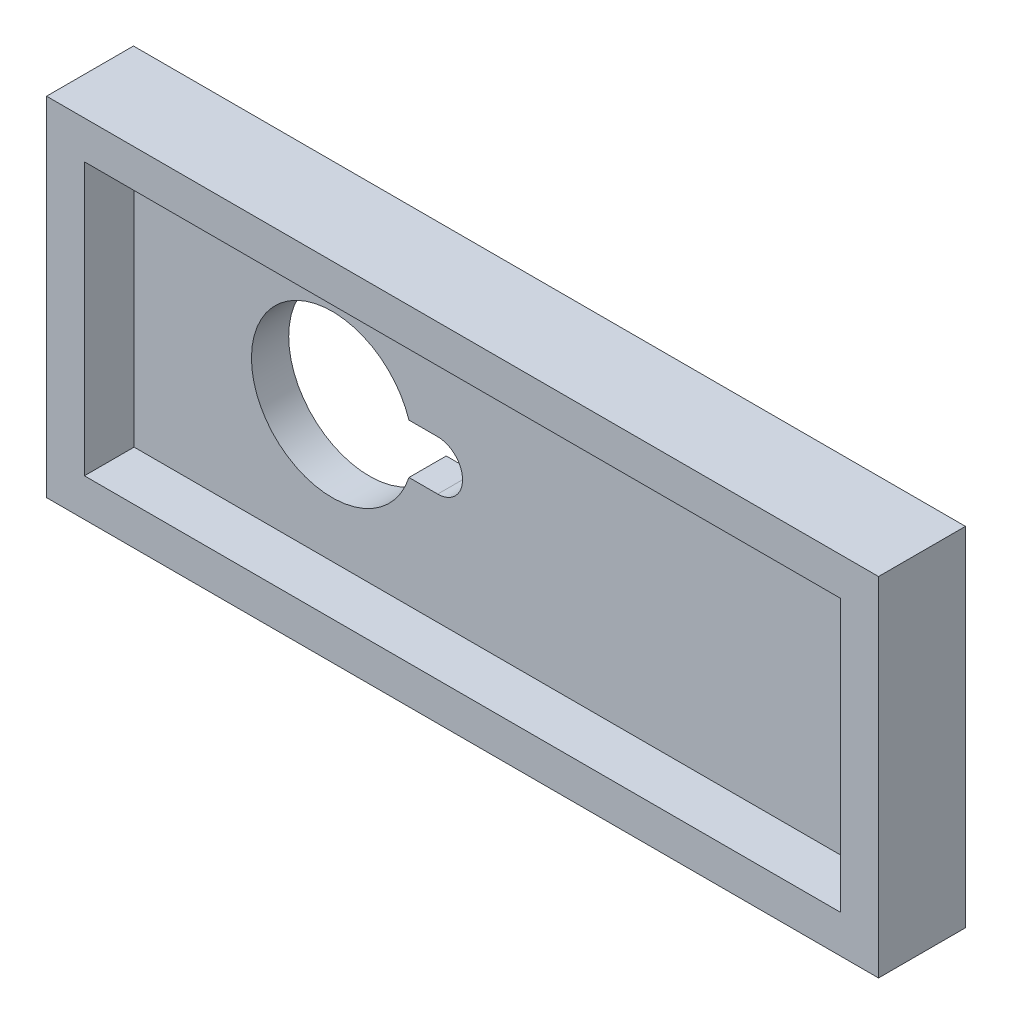
ISO-10303-21;
HEADER;
FILE_DESCRIPTION(('STEP AP214'),'2;1');
FILE_NAME('part.step','',(''),(''),'','','');
FILE_SCHEMA(('AUTOMOTIVE_DESIGN { 1 0 10303 214 1 1 1 1 }'));
ENDSEC;
DATA;
#1=APPLICATION_CONTEXT('core data for automotive mechanical design processes');
#2=APPLICATION_PROTOCOL_DEFINITION('international standard','automotive_design',2000,#1);
#3=PRODUCT_CONTEXT('',#1,'mechanical');
#4=PRODUCT('Part','Part','',(#3));
#5=PRODUCT_RELATED_PRODUCT_CATEGORY('part','',(#4));
#6=PRODUCT_DEFINITION_FORMATION('','',#4);
#7=PRODUCT_DEFINITION_CONTEXT('part definition',#1,'design');
#8=PRODUCT_DEFINITION('design','',#6,#7);
#9=PRODUCT_DEFINITION_SHAPE('','',#8);
#10=(LENGTH_UNIT() NAMED_UNIT(*) SI_UNIT(.MILLI.,.METRE.));
#11=(NAMED_UNIT(*) PLANE_ANGLE_UNIT() SI_UNIT($,.RADIAN.));
#12=(NAMED_UNIT(*) SI_UNIT($,.STERADIAN.) SOLID_ANGLE_UNIT());
#13=UNCERTAINTY_MEASURE_WITH_UNIT(LENGTH_MEASURE(1.E-05),#10,'distance_accuracy_value','');
#14=(GEOMETRIC_REPRESENTATION_CONTEXT(3) GLOBAL_UNCERTAINTY_ASSIGNED_CONTEXT((#13)) GLOBAL_UNIT_ASSIGNED_CONTEXT((#10,
#11,#12)) REPRESENTATION_CONTEXT('',''));
#15=CARTESIAN_POINT('',(0.,0.,0.));
#16=DIRECTION('',(0.,0.,1.));
#17=DIRECTION('',(1.,0.,0.));
#18=AXIS2_PLACEMENT_3D('',#15,#16,#17);
#19=CARTESIAN_POINT('',(-73.5021566864835,31.6809954751131,7.));
#20=DIRECTION('',(1.,0.,0.));
#21=DIRECTION('',(0.,0.,-1.));
#22=AXIS2_PLACEMENT_3D('',#19,#20,#21);
#23=PLANE('',#22);
#24=DIRECTION('',(0.,-1.,0.));
#25=VECTOR('',#24,1.);
#26=CARTESIAN_POINT('',(-73.5021566864835,31.6809954751131,0.));
#27=LINE('',#26,#25);
#28=CARTESIAN_POINT('',(-73.5021566864835,31.6809954751131,0.));
#29=VERTEX_POINT('',#28);
#30=CARTESIAN_POINT('',(-73.5021566864835,3.68099547511312,0.));
#31=VERTEX_POINT('',#30);
#32=EDGE_CURVE('E174',#29,#31,#27,.T.);
#33=ORIENTED_EDGE('',*,*,#32,.T.);
#34=DIRECTION('',(0.,0.,-1.));
#35=VECTOR('',#34,1.);
#36=CARTESIAN_POINT('',(-73.5021566864835,3.68099547511312,7.));
#37=LINE('',#36,#35);
#38=CARTESIAN_POINT('',(-73.5021566864835,3.68099547511312,7.));
#39=VERTEX_POINT('',#38);
#40=EDGE_CURVE('E207',#39,#31,#37,.T.);
#41=ORIENTED_EDGE('',*,*,#40,.F.);
#42=DIRECTION('',(0.,-1.,0.));
#43=VECTOR('',#42,1.);
#44=CARTESIAN_POINT('',(-73.5021566864835,31.6809954751131,7.));
#45=LINE('',#44,#43);
#46=CARTESIAN_POINT('',(-73.5021566864835,31.6809954751131,7.));
#47=VERTEX_POINT('',#46);
#48=EDGE_CURVE('E181',#47,#39,#45,.T.);
#49=ORIENTED_EDGE('',*,*,#48,.F.);
#50=DIRECTION('',(0.,0.,-1.));
#51=VECTOR('',#50,1.);
#52=CARTESIAN_POINT('',(-73.5021566864835,31.6809954751131,7.));
#53=LINE('',#52,#51);
#54=EDGE_CURVE('E191',#47,#29,#53,.T.);
#55=ORIENTED_EDGE('',*,*,#54,.T.);
#56=EDGE_LOOP('',(#33,#41,#49,#55));
#57=FACE_BOUND('',#56,.T.);
#58=ADVANCED_FACE('F33',(#57),#23,.F.);
#59=CARTESIAN_POINT('',(-73.5021566864835,3.68099547511312,7.));
#60=DIRECTION('',(0.,1.,0.));
#61=DIRECTION('',(0.,0.,1.));
#62=AXIS2_PLACEMENT_3D('',#59,#60,#61);
#63=PLANE('',#62);
#64=DIRECTION('',(1.,0.,0.));
#65=VECTOR('',#64,1.);
#66=CARTESIAN_POINT('',(-73.5021566864835,3.68099547511312,0.));
#67=LINE('',#66,#65);
#68=CARTESIAN_POINT('',(-6.50215668648349,3.68099547511312,0.));
#69=VERTEX_POINT('',#68);
#70=EDGE_CURVE('E194',#31,#69,#67,.T.);
#71=ORIENTED_EDGE('',*,*,#70,.T.);
#72=DIRECTION('',(0.,0.,-1.));
#73=VECTOR('',#72,1.);
#74=CARTESIAN_POINT('',(-6.50215668648349,3.68099547511312,7.));
#75=LINE('',#74,#73);
#76=CARTESIAN_POINT('',(-6.50215668648349,3.68099547511312,7.));
#77=VERTEX_POINT('',#76);
#78=EDGE_CURVE('E204',#77,#69,#75,.T.);
#79=ORIENTED_EDGE('',*,*,#78,.F.);
#80=DIRECTION('',(1.,0.,0.));
#81=VECTOR('',#80,1.);
#82=CARTESIAN_POINT('',(-73.5021566864835,3.68099547511312,7.));
#83=LINE('',#82,#81);
#84=EDGE_CURVE('E184',#39,#77,#83,.T.);
#85=ORIENTED_EDGE('',*,*,#84,.F.);
#86=ORIENTED_EDGE('',*,*,#40,.T.);
#87=EDGE_LOOP('',(#71,#79,#85,#86));
#88=FACE_BOUND('',#87,.T.);
#89=ADVANCED_FACE('F232',(#88),#63,.F.);
#90=CARTESIAN_POINT('',(-6.50215668648348,31.6809954751131,7.));
#91=DIRECTION('',(-1.,0.,0.));
#92=DIRECTION('',(0.,-1.,0.));
#93=AXIS2_PLACEMENT_3D('',#90,#91,#92);
#94=PLANE('',#93);
#95=DIRECTION('',(0.,1.,0.));
#96=VECTOR('',#95,1.);
#97=CARTESIAN_POINT('',(-6.50215668648348,31.6809954751131,0.));
#98=LINE('',#97,#96);
#99=CARTESIAN_POINT('',(-6.50215668648348,31.6809954751131,0.));
#100=VERTEX_POINT('',#99);
#101=EDGE_CURVE('E196',#69,#100,#98,.T.);
#102=ORIENTED_EDGE('',*,*,#101,.T.);
#103=DIRECTION('',(0.,0.,-1.));
#104=VECTOR('',#103,1.);
#105=CARTESIAN_POINT('',(-6.50215668648348,31.6809954751131,7.));
#106=LINE('',#105,#104);
#107=CARTESIAN_POINT('',(-6.50215668648348,31.6809954751131,7.));
#108=VERTEX_POINT('',#107);
#109=EDGE_CURVE('E201',#108,#100,#106,.T.);
#110=ORIENTED_EDGE('',*,*,#109,.F.);
#111=DIRECTION('',(0.,1.,0.));
#112=VECTOR('',#111,1.);
#113=CARTESIAN_POINT('',(-6.50215668648348,31.6809954751131,7.));
#114=LINE('',#113,#112);
#115=EDGE_CURVE('E187',#77,#108,#114,.T.);
#116=ORIENTED_EDGE('',*,*,#115,.F.);
#117=ORIENTED_EDGE('',*,*,#78,.T.);
#118=EDGE_LOOP('',(#102,#110,#116,#117));
#119=FACE_BOUND('',#118,.T.);
#120=ADVANCED_FACE('F237',(#119),#94,.F.);
#121=CARTESIAN_POINT('',(-73.5021566864835,31.6809954751131,7.));
#122=DIRECTION('',(0.,-1.,0.));
#123=DIRECTION('',(0.,0.,-1.));
#124=AXIS2_PLACEMENT_3D('',#121,#122,#123);
#125=PLANE('',#124);
#126=DIRECTION('',(-1.,0.,0.));
#127=VECTOR('',#126,1.);
#128=CARTESIAN_POINT('',(-73.5021566864835,31.6809954751131,0.));
#129=LINE('',#128,#127);
#130=EDGE_CURVE('E185',#100,#29,#129,.T.);
#131=ORIENTED_EDGE('',*,*,#130,.T.);
#132=ORIENTED_EDGE('',*,*,#54,.F.);
#133=DIRECTION('',(-1.,0.,0.));
#134=VECTOR('',#133,1.);
#135=CARTESIAN_POINT('',(-73.5021566864835,31.6809954751131,7.));
#136=LINE('',#135,#134);
#137=EDGE_CURVE('E189',#108,#47,#136,.T.);
#138=ORIENTED_EDGE('',*,*,#137,.F.);
#139=ORIENTED_EDGE('',*,*,#109,.T.);
#140=EDGE_LOOP('',(#131,#132,#138,#139));
#141=FACE_BOUND('',#140,.T.);
#142=ADVANCED_FACE('F252',(#141),#125,.F.);
#143=CARTESIAN_POINT('',(0.,0.,7.));
#144=DIRECTION('',(0.,0.,1.));
#145=DIRECTION('',(1.,0.,0.));
#146=AXIS2_PLACEMENT_3D('',#143,#144,#145);
#147=PLANE('',#146);
#148=DIRECTION('',(0.,-1.,0.));
#149=VECTOR('',#148,1.);
#150=CARTESIAN_POINT('',(-70.4521566864835,28.6309954751131,7.));
#151=LINE('',#150,#149);
#152=CARTESIAN_POINT('',(-70.4521566864835,28.6309954751131,7.));
#153=VERTEX_POINT('',#152);
#154=CARTESIAN_POINT('',(-70.4521566864835,6.73099547511312,7.));
#155=VERTEX_POINT('',#154);
#156=EDGE_CURVE('E146',#153,#155,#151,.T.);
#157=ORIENTED_EDGE('',*,*,#156,.F.);
#158=DIRECTION('',(-1.,0.,0.));
#159=VECTOR('',#158,1.);
#160=CARTESIAN_POINT('',(-70.4521566864835,28.6309954751131,7.));
#161=LINE('',#160,#159);
#162=CARTESIAN_POINT('',(-9.55215668648349,28.6309954751131,7.));
#163=VERTEX_POINT('',#162);
#164=EDGE_CURVE('E153',#163,#153,#161,.T.);
#165=ORIENTED_EDGE('',*,*,#164,.F.);
#166=DIRECTION('',(0.,1.,0.));
#167=VECTOR('',#166,1.);
#168=CARTESIAN_POINT('',(-9.55215668648349,28.6309954751131,7.));
#169=LINE('',#168,#167);
#170=CARTESIAN_POINT('',(-9.55215668648349,6.73099547511312,7.));
#171=VERTEX_POINT('',#170);
#172=EDGE_CURVE('E167',#171,#163,#169,.T.);
#173=ORIENTED_EDGE('',*,*,#172,.F.);
#174=DIRECTION('',(1.,0.,0.));
#175=VECTOR('',#174,1.);
#176=CARTESIAN_POINT('',(-70.4521566864835,6.73099547511312,7.));
#177=LINE('',#176,#175);
#178=EDGE_CURVE('E164',#155,#171,#177,.T.);
#179=ORIENTED_EDGE('',*,*,#178,.F.);
#180=EDGE_LOOP('',(#157,#165,#173,#179));
#181=FACE_BOUND('',#180,.T.);
#182=ORIENTED_EDGE('',*,*,#48,.T.);
#183=ORIENTED_EDGE('',*,*,#84,.T.);
#184=ORIENTED_EDGE('',*,*,#115,.T.);
#185=ORIENTED_EDGE('',*,*,#137,.T.);
#186=EDGE_LOOP('',(#182,#183,#184,#185));
#187=FACE_BOUND('',#186,.T.);
#188=ADVANCED_FACE('F248',(#181,#187),#147,.T.);
#189=CARTESIAN_POINT('',(0.,0.,0.));
#190=DIRECTION('',(0.,0.,1.));
#191=DIRECTION('',(1.,0.,0.));
#192=AXIS2_PLACEMENT_3D('',#189,#190,#191);
#193=PLANE('',#192);
#194=DIRECTION('',(-1.,0.,0.));
#195=VECTOR('',#194,1.);
#196=CARTESIAN_POINT('',(-46.0021566864835,15.6809954751131,0.));
#197=LINE('',#196,#195);
#198=CARTESIAN_POINT('',(-46.0021566864835,15.6809954751131,0.));
#199=VERTEX_POINT('',#198);
#200=CARTESIAN_POINT('',(-48.317498248057,15.6809954751131,0.));
#201=VERTEX_POINT('',#200);
#202=EDGE_CURVE('E132',#199,#201,#197,.T.);
#203=ORIENTED_EDGE('',*,*,#202,.F.);
#204=CARTESIAN_POINT('',(-46.0021566864835,17.6809954751131,0.));
#205=DIRECTION('',(0.,0.,-1.));
#206=DIRECTION('',(1.,0.,0.));
#207=AXIS2_PLACEMENT_3D('',#204,#205,#206);
#208=CIRCLE('',#207,2.00000000000001);
#209=CARTESIAN_POINT('',(-46.0021566864835,19.6809954751131,0.));
#210=VERTEX_POINT('',#209);
#211=EDGE_CURVE('E47',#210,#199,#208,.T.);
#212=ORIENTED_EDGE('',*,*,#211,.F.);
#213=DIRECTION('',(1.,0.,0.));
#214=VECTOR('',#213,1.);
#215=CARTESIAN_POINT('',(-46.0021566864835,19.6809954751131,0.));
#216=LINE('',#215,#214);
#217=CARTESIAN_POINT('',(-48.317498248057,19.6809954751131,0.));
#218=VERTEX_POINT('',#217);
#219=EDGE_CURVE('E139',#218,#210,#216,.T.);
#220=ORIENTED_EDGE('',*,*,#219,.F.);
#221=CARTESIAN_POINT('',(-54.5021566864835,17.6809954751131,0.));
#222=DIRECTION('',(0.,0.,-1.));
#223=DIRECTION('',(-1.,0.,0.));
#224=AXIS2_PLACEMENT_3D('',#221,#222,#223);
#225=CIRCLE('',#224,6.5);
#226=EDGE_CURVE('E123',#201,#218,#225,.T.);
#227=ORIENTED_EDGE('',*,*,#226,.F.);
#228=EDGE_LOOP('',(#203,#212,#220,#227));
#229=FACE_BOUND('',#228,.T.);
#230=ORIENTED_EDGE('',*,*,#32,.F.);
#231=ORIENTED_EDGE('',*,*,#130,.F.);
#232=ORIENTED_EDGE('',*,*,#101,.F.);
#233=ORIENTED_EDGE('',*,*,#70,.F.);
#234=EDGE_LOOP('',(#230,#231,#232,#233));
#235=FACE_BOUND('',#234,.T.);
#236=ADVANCED_FACE('F136',(#229,#235),#193,.F.);
#237=CARTESIAN_POINT('',(-70.4521566864835,28.6309954751131,3.));
#238=DIRECTION('',(-1.,0.,0.));
#239=DIRECTION('',(0.,0.,1.));
#240=AXIS2_PLACEMENT_3D('',#237,#238,#239);
#241=PLANE('',#240);
#242=ORIENTED_EDGE('',*,*,#156,.T.);
#243=DIRECTION('',(0.,0.,1.));
#244=VECTOR('',#243,1.);
#245=CARTESIAN_POINT('',(-70.4521566864835,6.73099547511312,3.));
#246=LINE('',#245,#244);
#247=CARTESIAN_POINT('',(-70.4521566864835,6.73099547511312,3.));
#248=VERTEX_POINT('',#247);
#249=EDGE_CURVE('E162',#248,#155,#246,.T.);
#250=ORIENTED_EDGE('',*,*,#249,.F.);
#251=DIRECTION('',(0.,-1.,0.));
#252=VECTOR('',#251,1.);
#253=CARTESIAN_POINT('',(-70.4521566864835,28.6309954751131,3.));
#254=LINE('',#253,#252);
#255=CARTESIAN_POINT('',(-70.4521566864835,28.6309954751131,3.));
#256=VERTEX_POINT('',#255);
#257=EDGE_CURVE('E149',#256,#248,#254,.T.);
#258=ORIENTED_EDGE('',*,*,#257,.F.);
#259=DIRECTION('',(0.,0.,1.));
#260=VECTOR('',#259,1.);
#261=CARTESIAN_POINT('',(-70.4521566864835,28.6309954751131,3.));
#262=LINE('',#261,#260);
#263=EDGE_CURVE('E172',#256,#153,#262,.T.);
#264=ORIENTED_EDGE('',*,*,#263,.T.);
#265=EDGE_LOOP('',(#242,#250,#258,#264));
#266=FACE_BOUND('',#265,.T.);
#267=ADVANCED_FACE('F263',(#266),#241,.F.);
#268=CARTESIAN_POINT('',(-70.4521566864835,28.6309954751131,3.));
#269=DIRECTION('',(0.,1.,0.));
#270=DIRECTION('',(0.,0.,1.));
#271=AXIS2_PLACEMENT_3D('',#268,#269,#270);
#272=PLANE('',#271);
#273=ORIENTED_EDGE('',*,*,#164,.T.);
#274=ORIENTED_EDGE('',*,*,#263,.F.);
#275=DIRECTION('',(-1.,0.,0.));
#276=VECTOR('',#275,1.);
#277=CARTESIAN_POINT('',(-70.4521566864835,28.6309954751131,3.));
#278=LINE('',#277,#276);
#279=CARTESIAN_POINT('',(-9.55215668648349,28.6309954751131,3.));
#280=VERTEX_POINT('',#279);
#281=EDGE_CURVE('E159',#280,#256,#278,.T.);
#282=ORIENTED_EDGE('',*,*,#281,.F.);
#283=DIRECTION('',(0.,0.,1.));
#284=VECTOR('',#283,1.);
#285=CARTESIAN_POINT('',(-9.55215668648349,28.6309954751131,3.));
#286=LINE('',#285,#284);
#287=EDGE_CURVE('E175',#280,#163,#286,.T.);
#288=ORIENTED_EDGE('',*,*,#287,.T.);
#289=EDGE_LOOP('',(#273,#274,#282,#288));
#290=FACE_BOUND('',#289,.T.);
#291=ADVANCED_FACE('F269',(#290),#272,.F.);
#292=CARTESIAN_POINT('',(-9.55215668648349,28.6309954751131,3.));
#293=DIRECTION('',(1.,0.,0.));
#294=DIRECTION('',(0.,0.,-1.));
#295=AXIS2_PLACEMENT_3D('',#292,#293,#294);
#296=PLANE('',#295);
#297=ORIENTED_EDGE('',*,*,#172,.T.);
#298=ORIENTED_EDGE('',*,*,#287,.F.);
#299=DIRECTION('',(0.,1.,0.));
#300=VECTOR('',#299,1.);
#301=CARTESIAN_POINT('',(-9.55215668648349,28.6309954751131,3.));
#302=LINE('',#301,#300);
#303=CARTESIAN_POINT('',(-9.55215668648349,6.73099547511312,3.));
#304=VERTEX_POINT('',#303);
#305=EDGE_CURVE('E156',#304,#280,#302,.T.);
#306=ORIENTED_EDGE('',*,*,#305,.F.);
#307=DIRECTION('',(0.,0.,1.));
#308=VECTOR('',#307,1.);
#309=CARTESIAN_POINT('',(-9.55215668648349,6.73099547511312,3.));
#310=LINE('',#309,#308);
#311=EDGE_CURVE('E177',#304,#171,#310,.T.);
#312=ORIENTED_EDGE('',*,*,#311,.T.);
#313=EDGE_LOOP('',(#297,#298,#306,#312));
#314=FACE_BOUND('',#313,.T.);
#315=ADVANCED_FACE('F273',(#314),#296,.F.);
#316=CARTESIAN_POINT('',(-70.4521566864835,6.73099547511312,3.));
#317=DIRECTION('',(0.,-1.,0.));
#318=DIRECTION('',(0.,0.,-1.));
#319=AXIS2_PLACEMENT_3D('',#316,#317,#318);
#320=PLANE('',#319);
#321=ORIENTED_EDGE('',*,*,#178,.T.);
#322=ORIENTED_EDGE('',*,*,#311,.F.);
#323=DIRECTION('',(1.,0.,0.));
#324=VECTOR('',#323,1.);
#325=CARTESIAN_POINT('',(-70.4521566864835,6.73099547511312,3.));
#326=LINE('',#325,#324);
#327=EDGE_CURVE('E152',#248,#304,#326,.T.);
#328=ORIENTED_EDGE('',*,*,#327,.F.);
#329=ORIENTED_EDGE('',*,*,#249,.T.);
#330=EDGE_LOOP('',(#321,#322,#328,#329));
#331=FACE_BOUND('',#330,.T.);
#332=ADVANCED_FACE('F228',(#331),#320,.F.);
#333=CARTESIAN_POINT('',(0.,0.,3.));
#334=DIRECTION('',(0.,0.,1.));
#335=DIRECTION('',(1.,0.,0.));
#336=AXIS2_PLACEMENT_3D('',#333,#334,#335);
#337=PLANE('',#336);
#338=CARTESIAN_POINT('',(-46.0021566864835,17.6809954751131,3.));
#339=DIRECTION('',(0.,0.,1.));
#340=DIRECTION('',(1.,0.,0.));
#341=AXIS2_PLACEMENT_3D('',#338,#339,#340);
#342=CIRCLE('',#341,2.00000000000001);
#343=CARTESIAN_POINT('',(-46.0021566864835,15.6809954751131,3.));
#344=VERTEX_POINT('',#343);
#345=CARTESIAN_POINT('',(-46.0021566864835,19.6809954751131,3.));
#346=VERTEX_POINT('',#345);
#347=EDGE_CURVE('E11',#344,#346,#342,.T.);
#348=ORIENTED_EDGE('',*,*,#347,.F.);
#349=DIRECTION('',(1.,0.,0.));
#350=VECTOR('',#349,1.);
#351=CARTESIAN_POINT('',(0.,15.6809954751131,3.));
#352=LINE('',#351,#350);
#353=CARTESIAN_POINT('',(-48.317498248057,15.6809954751131,3.));
#354=VERTEX_POINT('',#353);
#355=EDGE_CURVE('E210',#354,#344,#352,.T.);
#356=ORIENTED_EDGE('',*,*,#355,.F.);
#357=CARTESIAN_POINT('',(-54.5021566864835,17.6809954751131,3.));
#358=DIRECTION('',(0.,0.,1.));
#359=DIRECTION('',(1.,0.,0.));
#360=AXIS2_PLACEMENT_3D('',#357,#358,#359);
#361=CIRCLE('',#360,6.5);
#362=CARTESIAN_POINT('',(-48.317498248057,19.6809954751131,3.));
#363=VERTEX_POINT('',#362);
#364=EDGE_CURVE('E126',#363,#354,#361,.T.);
#365=ORIENTED_EDGE('',*,*,#364,.F.);
#366=DIRECTION('',(-1.,0.,0.));
#367=VECTOR('',#366,1.);
#368=CARTESIAN_POINT('',(0.,19.6809954751131,3.));
#369=LINE('',#368,#367);
#370=EDGE_CURVE('E40',#346,#363,#369,.T.);
#371=ORIENTED_EDGE('',*,*,#370,.F.);
#372=EDGE_LOOP('',(#348,#356,#365,#371));
#373=FACE_BOUND('',#372,.T.);
#374=ORIENTED_EDGE('',*,*,#257,.T.);
#375=ORIENTED_EDGE('',*,*,#327,.T.);
#376=ORIENTED_EDGE('',*,*,#305,.T.);
#377=ORIENTED_EDGE('',*,*,#281,.T.);
#378=EDGE_LOOP('',(#374,#375,#376,#377));
#379=FACE_BOUND('',#378,.T.);
#380=ADVANCED_FACE('F218',(#373,#379),#337,.T.);
#381=CARTESIAN_POINT('',(-46.0021566864835,17.6809954751131,7.));
#382=DIRECTION('',(0.,0.,-1.));
#383=DIRECTION('',(-1.,0.,0.));
#384=AXIS2_PLACEMENT_3D('',#381,#382,#383);
#385=CYLINDRICAL_SURFACE('',#384,2.00000000000001);
#386=ORIENTED_EDGE('',*,*,#347,.T.);
#387=DIRECTION('',(0.,0.,-1.));
#388=VECTOR('',#387,1.);
#389=CARTESIAN_POINT('',(-46.0021566864835,19.6809954751131,7.));
#390=LINE('',#389,#388);
#391=EDGE_CURVE('E144',#346,#210,#390,.T.);
#392=ORIENTED_EDGE('',*,*,#391,.T.);
#393=ORIENTED_EDGE('',*,*,#211,.T.);
#394=DIRECTION('',(0.,0.,-1.));
#395=VECTOR('',#394,1.);
#396=CARTESIAN_POINT('',(-46.0021566864835,15.6809954751131,7.));
#397=LINE('',#396,#395);
#398=EDGE_CURVE('E129',#344,#199,#397,.T.);
#399=ORIENTED_EDGE('',*,*,#398,.F.);
#400=EDGE_LOOP('',(#386,#392,#393,#399));
#401=FACE_BOUND('',#400,.T.);
#402=ADVANCED_FACE('F220',(#401),#385,.F.);
#403=CARTESIAN_POINT('',(-46.0021566864835,19.6809954751131,7.));
#404=DIRECTION('',(0.,1.,0.));
#405=DIRECTION('',(0.,0.,1.));
#406=AXIS2_PLACEMENT_3D('',#403,#404,#405);
#407=PLANE('',#406);
#408=ORIENTED_EDGE('',*,*,#370,.T.);
#409=DIRECTION('',(0.,0.,-1.));
#410=VECTOR('',#409,1.);
#411=CARTESIAN_POINT('',(-48.317498248057,19.6809954751131,7.));
#412=LINE('',#411,#410);
#413=EDGE_CURVE('E128',#363,#218,#412,.T.);
#414=ORIENTED_EDGE('',*,*,#413,.T.);
#415=ORIENTED_EDGE('',*,*,#219,.T.);
#416=ORIENTED_EDGE('',*,*,#391,.F.);
#417=EDGE_LOOP('',(#408,#414,#415,#416));
#418=FACE_BOUND('',#417,.T.);
#419=ADVANCED_FACE('F215',(#418),#407,.F.);
#420=CARTESIAN_POINT('',(-54.5021566864835,17.6809954751131,7.));
#421=DIRECTION('',(0.,0.,-1.));
#422=DIRECTION('',(-1.,0.,0.));
#423=AXIS2_PLACEMENT_3D('',#420,#421,#422);
#424=CYLINDRICAL_SURFACE('',#423,6.5);
#425=ORIENTED_EDGE('',*,*,#364,.T.);
#426=DIRECTION('',(0.,0.,-1.));
#427=VECTOR('',#426,1.);
#428=CARTESIAN_POINT('',(-48.317498248057,15.6809954751131,7.));
#429=LINE('',#428,#427);
#430=EDGE_CURVE('E55',#354,#201,#429,.T.);
#431=ORIENTED_EDGE('',*,*,#430,.T.);
#432=ORIENTED_EDGE('',*,*,#226,.T.);
#433=ORIENTED_EDGE('',*,*,#413,.F.);
#434=EDGE_LOOP('',(#425,#431,#432,#433));
#435=FACE_BOUND('',#434,.T.);
#436=ADVANCED_FACE('F120',(#435),#424,.F.);
#437=CARTESIAN_POINT('',(-46.0021566864835,15.6809954751131,7.));
#438=DIRECTION('',(0.,-1.,0.));
#439=DIRECTION('',(0.,0.,-1.));
#440=AXIS2_PLACEMENT_3D('',#437,#438,#439);
#441=PLANE('',#440);
#442=ORIENTED_EDGE('',*,*,#355,.T.);
#443=ORIENTED_EDGE('',*,*,#398,.T.);
#444=ORIENTED_EDGE('',*,*,#202,.T.);
#445=ORIENTED_EDGE('',*,*,#430,.F.);
#446=EDGE_LOOP('',(#442,#443,#444,#445));
#447=FACE_BOUND('',#446,.T.);
#448=ADVANCED_FACE('F133',(#447),#441,.F.);
#449=CLOSED_SHELL('',(#58,#89,#120,#142,#188,#236,#267,#291,#315,#332,#380,#402,#419,#436,#448));
#450=MANIFOLD_SOLID_BREP('B2',#449);
#451=ADVANCED_BREP_SHAPE_REPRESENTATION('',(#18,#450),#14);
#452=SHAPE_DEFINITION_REPRESENTATION(#9,#451);
ENDSEC;
END-ISO-10303-21;
